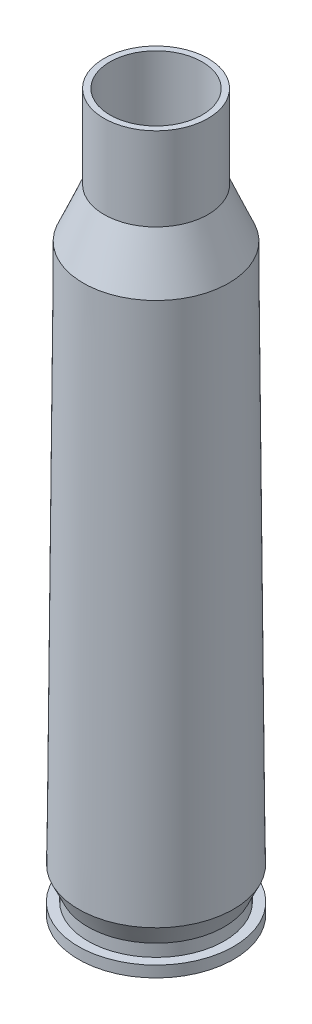
ISO-10303-21;
HEADER;
FILE_DESCRIPTION(('STEP AP214'),'2;1');
FILE_NAME('part.step','',(''),(''),'','','');
FILE_SCHEMA(('AUTOMOTIVE_DESIGN { 1 0 10303 214 1 1 1 1 }'));
ENDSEC;
DATA;
#1=APPLICATION_CONTEXT('core data for automotive mechanical design processes');
#2=APPLICATION_PROTOCOL_DEFINITION('international standard','automotive_design',2000,#1);
#3=PRODUCT_CONTEXT('',#1,'mechanical');
#4=PRODUCT('Part','Part','',(#3));
#5=PRODUCT_RELATED_PRODUCT_CATEGORY('part','',(#4));
#6=PRODUCT_DEFINITION_FORMATION('','',#4);
#7=PRODUCT_DEFINITION_CONTEXT('part definition',#1,'design');
#8=PRODUCT_DEFINITION('design','',#6,#7);
#9=PRODUCT_DEFINITION_SHAPE('','',#8);
#10=(LENGTH_UNIT() NAMED_UNIT(*) SI_UNIT(.MILLI.,.METRE.));
#11=(NAMED_UNIT(*) PLANE_ANGLE_UNIT() SI_UNIT($,.RADIAN.));
#12=(NAMED_UNIT(*) SI_UNIT($,.STERADIAN.) SOLID_ANGLE_UNIT());
#13=UNCERTAINTY_MEASURE_WITH_UNIT(LENGTH_MEASURE(1.E-05),#10,'distance_accuracy_value','');
#14=(GEOMETRIC_REPRESENTATION_CONTEXT(3) GLOBAL_UNCERTAINTY_ASSIGNED_CONTEXT((#13)) GLOBAL_UNIT_ASSIGNED_CONTEXT((#10,
#11,#12)) REPRESENTATION_CONTEXT('',''));
#15=CARTESIAN_POINT('',(0.,0.,0.));
#16=DIRECTION('',(0.,0.,1.));
#17=DIRECTION('',(1.,0.,0.));
#18=AXIS2_PLACEMENT_3D('',#15,#16,#17);
#19=CARTESIAN_POINT('',(-2.85,44.7,0.));
#20=DIRECTION('',(0.,-1.,0.));
#21=DIRECTION('',(0.,0.,-1.));
#22=AXIS2_PLACEMENT_3D('',#19,#20,#21);
#23=PLANE('',#22);
#24=CARTESIAN_POINT('',(0.,44.7,0.));
#25=DIRECTION('',(0.,-1.,0.));
#26=DIRECTION('',(0.,0.,-1.));
#27=AXIS2_PLACEMENT_3D('',#24,#25,#26);
#28=CIRCLE('',#27,3.215);
#29=CARTESIAN_POINT('',(0.,44.7,-3.215));
#30=VERTEX_POINT('',#29);
#31=EDGE_CURVE('E10',#30,#30,#28,.T.);
#32=ORIENTED_EDGE('',*,*,#31,.F.);
#33=EDGE_LOOP('',(#32));
#34=FACE_BOUND('',#33,.T.);
#35=CARTESIAN_POINT('',(0.,44.7,0.));
#36=DIRECTION('',(0.,-1.,0.));
#37=DIRECTION('',(0.,0.,-1.));
#38=AXIS2_PLACEMENT_3D('',#35,#36,#37);
#39=CIRCLE('',#38,2.85);
#40=CARTESIAN_POINT('',(0.,44.7,-2.85));
#41=VERTEX_POINT('',#40);
#42=EDGE_CURVE('E79',#41,#41,#39,.T.);
#43=ORIENTED_EDGE('',*,*,#42,.T.);
#44=EDGE_LOOP('',(#43));
#45=FACE_BOUND('',#44,.T.);
#46=ADVANCED_FACE('F30',(#34,#45),#23,.F.);
#47=CARTESIAN_POINT('',(0.,0.,0.));
#48=DIRECTION('',(0.,-1.,0.));
#49=DIRECTION('',(0.,0.,-1.));
#50=AXIS2_PLACEMENT_3D('',#47,#48,#49);
#51=CYLINDRICAL_SURFACE('',#50,3.215);
#52=CARTESIAN_POINT('',(0.,39.55,0.));
#53=DIRECTION('',(0.,-1.,0.));
#54=DIRECTION('',(0.,0.,-1.));
#55=AXIS2_PLACEMENT_3D('',#52,#53,#54);
#56=CIRCLE('',#55,3.215);
#57=CARTESIAN_POINT('',(0.,39.55,-3.215));
#58=VERTEX_POINT('',#57);
#59=EDGE_CURVE('E36',#58,#58,#56,.T.);
#60=ORIENTED_EDGE('',*,*,#59,.F.);
#61=EDGE_LOOP('',(#60));
#62=FACE_BOUND('',#61,.T.);
#63=ORIENTED_EDGE('',*,*,#31,.T.);
#64=EDGE_LOOP('',(#63));
#65=FACE_BOUND('',#64,.T.);
#66=ADVANCED_FACE('F125',(#62,#65),#51,.T.);
#67=CARTESIAN_POINT('',(0.,39.55,0.));
#68=DIRECTION('',(0.,-1.,0.));
#69=DIRECTION('',(0.,0.,-1.));
#70=AXIS2_PLACEMENT_3D('',#67,#68,#69);
#71=CONICAL_SURFACE('',#70,3.215,0.401101658812282);
#72=CARTESIAN_POINT('',(0.,36.52,0.));
#73=DIRECTION('',(0.,-1.,0.));
#74=DIRECTION('',(0.,0.,-1.));
#75=AXIS2_PLACEMENT_3D('',#72,#73,#74);
#76=CIRCLE('',#75,4.5);
#77=CARTESIAN_POINT('',(0.,36.52,-4.5));
#78=VERTEX_POINT('',#77);
#79=EDGE_CURVE('E40',#78,#78,#76,.T.);
#80=ORIENTED_EDGE('',*,*,#79,.F.);
#81=EDGE_LOOP('',(#80));
#82=FACE_BOUND('',#81,.T.);
#83=ORIENTED_EDGE('',*,*,#59,.T.);
#84=EDGE_LOOP('',(#83));
#85=FACE_BOUND('',#84,.T.);
#86=ADVANCED_FACE('F130',(#82,#85),#71,.T.);
#87=CARTESIAN_POINT('',(0.,36.52,0.));
#88=DIRECTION('',(0.,-1.,0.));
#89=DIRECTION('',(0.,0.,-1.));
#90=AXIS2_PLACEMENT_3D('',#87,#88,#89);
#91=CONICAL_SURFACE('',#90,4.5,0.00868501672487274);
#92=CARTESIAN_POINT('',(0.,3.13,0.));
#93=DIRECTION('',(0.,-1.,0.));
#94=DIRECTION('',(0.,0.,-1.));
#95=AXIS2_PLACEMENT_3D('',#92,#93,#94);
#96=CIRCLE('',#95,4.79);
#97=CARTESIAN_POINT('',(0.,3.13,-4.79));
#98=VERTEX_POINT('',#97);
#99=EDGE_CURVE('E44',#98,#98,#96,.T.);
#100=ORIENTED_EDGE('',*,*,#99,.F.);
#101=EDGE_LOOP('',(#100));
#102=FACE_BOUND('',#101,.T.);
#103=ORIENTED_EDGE('',*,*,#79,.T.);
#104=EDGE_LOOP('',(#103));
#105=FACE_BOUND('',#104,.T.);
#106=ADVANCED_FACE('F135',(#102,#105),#91,.T.);
#107=CARTESIAN_POINT('',(0.,3.13,0.));
#108=DIRECTION('',(0.,1.,0.));
#109=DIRECTION('',(0.,0.,1.));
#110=AXIS2_PLACEMENT_3D('',#107,#108,#109);
#111=CONICAL_SURFACE('',#110,4.79,0.436332312998583);
#112=CARTESIAN_POINT('',(0.,1.9,0.));
#113=DIRECTION('',(0.,-1.,0.));
#114=DIRECTION('',(0.,0.,-1.));
#115=AXIS2_PLACEMENT_3D('',#112,#113,#114);
#116=CIRCLE('',#115,4.21644158046935);
#117=CARTESIAN_POINT('',(0.,1.9,-4.21644158046935));
#118=VERTEX_POINT('',#117);
#119=EDGE_CURVE('E49',#118,#118,#116,.T.);
#120=ORIENTED_EDGE('',*,*,#119,.F.);
#121=EDGE_LOOP('',(#120));
#122=FACE_BOUND('',#121,.T.);
#123=ORIENTED_EDGE('',*,*,#99,.T.);
#124=EDGE_LOOP('',(#123));
#125=FACE_BOUND('',#124,.T.);
#126=ADVANCED_FACE('F141',(#122,#125),#111,.T.);
#127=CARTESIAN_POINT('',(0.,0.,0.));
#128=DIRECTION('',(0.,-1.,0.));
#129=DIRECTION('',(0.,0.,-1.));
#130=AXIS2_PLACEMENT_3D('',#127,#128,#129);
#131=CYLINDRICAL_SURFACE('',#130,4.21644158046935);
#132=CARTESIAN_POINT('',(0.,1.14,0.));
#133=DIRECTION('',(0.,-1.,0.));
#134=DIRECTION('',(0.,0.,-1.));
#135=AXIS2_PLACEMENT_3D('',#132,#133,#134);
#136=CIRCLE('',#135,4.21644158046935);
#137=CARTESIAN_POINT('',(0.,1.14,-4.21644158046935));
#138=VERTEX_POINT('',#137);
#139=EDGE_CURVE('E52',#138,#138,#136,.T.);
#140=ORIENTED_EDGE('',*,*,#139,.F.);
#141=EDGE_LOOP('',(#140));
#142=FACE_BOUND('',#141,.T.);
#143=ORIENTED_EDGE('',*,*,#119,.T.);
#144=EDGE_LOOP('',(#143));
#145=FACE_BOUND('',#144,.T.);
#146=ADVANCED_FACE('F145',(#142,#145),#131,.T.);
#147=CARTESIAN_POINT('',(-4.8,1.14,0.));
#148=DIRECTION('',(0.,-1.,0.));
#149=DIRECTION('',(0.,0.,-1.));
#150=AXIS2_PLACEMENT_3D('',#147,#148,#149);
#151=PLANE('',#150);
#152=CARTESIAN_POINT('',(0.,1.14,0.));
#153=DIRECTION('',(0.,-1.,0.));
#154=DIRECTION('',(0.,0.,-1.));
#155=AXIS2_PLACEMENT_3D('',#152,#153,#154);
#156=CIRCLE('',#155,4.8);
#157=CARTESIAN_POINT('',(0.,1.14,-4.8));
#158=VERTEX_POINT('',#157);
#159=EDGE_CURVE('E55',#158,#158,#156,.T.);
#160=ORIENTED_EDGE('',*,*,#159,.F.);
#161=EDGE_LOOP('',(#160));
#162=FACE_BOUND('',#161,.T.);
#163=ORIENTED_EDGE('',*,*,#139,.T.);
#164=EDGE_LOOP('',(#163));
#165=FACE_BOUND('',#164,.T.);
#166=ADVANCED_FACE('F149',(#162,#165),#151,.F.);
#167=CARTESIAN_POINT('',(0.,0.,0.));
#168=DIRECTION('',(0.,-1.,0.));
#169=DIRECTION('',(0.,0.,-1.));
#170=AXIS2_PLACEMENT_3D('',#167,#168,#169);
#171=CYLINDRICAL_SURFACE('',#170,4.8);
#172=CARTESIAN_POINT('',(0.,0.449999999999999,0.));
#173=DIRECTION('',(0.,-1.,0.));
#174=DIRECTION('',(0.,0.,-1.));
#175=AXIS2_PLACEMENT_3D('',#172,#173,#174);
#176=CIRCLE('',#175,4.8);
#177=CARTESIAN_POINT('',(0.,0.449999999999999,-4.8));
#178=VERTEX_POINT('',#177);
#179=EDGE_CURVE('E58',#178,#178,#176,.T.);
#180=ORIENTED_EDGE('',*,*,#179,.F.);
#181=EDGE_LOOP('',(#180));
#182=FACE_BOUND('',#181,.T.);
#183=ORIENTED_EDGE('',*,*,#159,.T.);
#184=EDGE_LOOP('',(#183));
#185=FACE_BOUND('',#184,.T.);
#186=ADVANCED_FACE('F153',(#182,#185),#171,.T.);
#187=CARTESIAN_POINT('',(0.,0.449999999999999,0.));
#188=DIRECTION('',(0.,1.,0.));
#189=DIRECTION('',(0.,0.,1.));
#190=AXIS2_PLACEMENT_3D('',#187,#188,#189);
#191=CONICAL_SURFACE('',#190,4.8,0.959931088596887);
#192=CARTESIAN_POINT('',(0.,0.,0.));
#193=DIRECTION('',(0.,-1.,0.));
#194=DIRECTION('',(0.,0.,-1.));
#195=AXIS2_PLACEMENT_3D('',#192,#193,#194);
#196=CIRCLE('',#195,4.15733339696604);
#197=CARTESIAN_POINT('',(0.,0.,-4.15733339696604));
#198=VERTEX_POINT('',#197);
#199=EDGE_CURVE('E61',#198,#198,#196,.T.);
#200=ORIENTED_EDGE('',*,*,#199,.F.);
#201=EDGE_LOOP('',(#200));
#202=FACE_BOUND('',#201,.T.);
#203=ORIENTED_EDGE('',*,*,#179,.T.);
#204=EDGE_LOOP('',(#203));
#205=FACE_BOUND('',#204,.T.);
#206=ADVANCED_FACE('F121',(#202,#205),#191,.T.);
#207=CARTESIAN_POINT('',(0.,0.,0.));
#208=DIRECTION('',(0.,1.,0.));
#209=DIRECTION('',(0.,0.,1.));
#210=AXIS2_PLACEMENT_3D('',#207,#208,#209);
#211=PLANE('',#210);
#212=ORIENTED_EDGE('',*,*,#199,.T.);
#213=EDGE_LOOP('',(#212));
#214=FACE_BOUND('',#213,.T.);
#215=ADVANCED_FACE('F116',(#214),#211,.F.);
#216=CARTESIAN_POINT('',(-3.36846844058709,1.14,0.));
#217=DIRECTION('',(0.,-1.,0.));
#218=DIRECTION('',(0.,0.,-1.));
#219=AXIS2_PLACEMENT_3D('',#216,#217,#218);
#220=PLANE('',#219);
#221=CARTESIAN_POINT('',(0.,1.14,0.));
#222=DIRECTION('',(0.,-1.,0.));
#223=DIRECTION('',(0.,0.,-1.));
#224=AXIS2_PLACEMENT_3D('',#221,#222,#223);
#225=CIRCLE('',#224,3.36846844058709);
#226=CARTESIAN_POINT('',(0.,1.14,-3.36846844058709));
#227=VERTEX_POINT('',#226);
#228=EDGE_CURVE('E64',#227,#227,#225,.T.);
#229=ORIENTED_EDGE('',*,*,#228,.F.);
#230=EDGE_LOOP('',(#229));
#231=FACE_BOUND('',#230,.T.);
#232=ADVANCED_FACE('F111',(#231),#220,.F.);
#233=CARTESIAN_POINT('',(0.,0.,0.));
#234=DIRECTION('',(0.,-1.,0.));
#235=DIRECTION('',(0.,0.,-1.));
#236=AXIS2_PLACEMENT_3D('',#233,#234,#235);
#237=CYLINDRICAL_SURFACE('',#236,3.36846844058709);
#238=CARTESIAN_POINT('',(0.,1.9,0.));
#239=DIRECTION('',(0.,-1.,0.));
#240=DIRECTION('',(0.,0.,-1.));
#241=AXIS2_PLACEMENT_3D('',#238,#239,#240);
#242=CIRCLE('',#241,3.36846844058709);
#243=CARTESIAN_POINT('',(0.,1.9,-3.36846844058709));
#244=VERTEX_POINT('',#243);
#245=EDGE_CURVE('E67',#244,#244,#242,.T.);
#246=ORIENTED_EDGE('',*,*,#245,.F.);
#247=EDGE_LOOP('',(#246));
#248=FACE_BOUND('',#247,.T.);
#249=ORIENTED_EDGE('',*,*,#228,.T.);
#250=EDGE_LOOP('',(#249));
#251=FACE_BOUND('',#250,.T.);
#252=ADVANCED_FACE('F105',(#248,#251),#237,.F.);
#253=CARTESIAN_POINT('',(0.,1.9,0.));
#254=DIRECTION('',(0.,1.,0.));
#255=DIRECTION('',(0.,0.,1.));
#256=AXIS2_PLACEMENT_3D('',#253,#254,#255);
#257=CONICAL_SURFACE('',#256,3.36846844058709,0.436332312998584);
#258=CARTESIAN_POINT('',(0.,3.13,0.));
#259=DIRECTION('',(0.,-1.,0.));
#260=DIRECTION('',(0.,0.,-1.));
#261=AXIS2_PLACEMENT_3D('',#258,#259,#260);
#262=CIRCLE('',#261,3.94202686011774);
#263=CARTESIAN_POINT('',(0.,3.13,-3.94202686011774));
#264=VERTEX_POINT('',#263);
#265=EDGE_CURVE('E70',#264,#264,#262,.T.);
#266=ORIENTED_EDGE('',*,*,#265,.F.);
#267=EDGE_LOOP('',(#266));
#268=FACE_BOUND('',#267,.T.);
#269=ORIENTED_EDGE('',*,*,#245,.T.);
#270=EDGE_LOOP('',(#269));
#271=FACE_BOUND('',#270,.T.);
#272=ADVANCED_FACE('F99',(#268,#271),#257,.F.);
#273=CARTESIAN_POINT('',(0.,0.,0.));
#274=DIRECTION('',(0.,-1.,0.));
#275=DIRECTION('',(0.,0.,-1.));
#276=AXIS2_PLACEMENT_3D('',#273,#274,#275);
#277=CYLINDRICAL_SURFACE('',#276,3.94202686011774);
#278=CARTESIAN_POINT('',(0.,36.3214334578176,0.));
#279=DIRECTION('',(0.,-1.,0.));
#280=DIRECTION('',(0.,0.,-1.));
#281=AXIS2_PLACEMENT_3D('',#278,#279,#280);
#282=CIRCLE('',#281,3.94202686011774);
#283=CARTESIAN_POINT('',(0.,36.3214334578176,-3.94202686011774));
#284=VERTEX_POINT('',#283);
#285=EDGE_CURVE('E73',#284,#284,#282,.T.);
#286=ORIENTED_EDGE('',*,*,#285,.F.);
#287=EDGE_LOOP('',(#286));
#288=FACE_BOUND('',#287,.T.);
#289=ORIENTED_EDGE('',*,*,#265,.T.);
#290=EDGE_LOOP('',(#289));
#291=FACE_BOUND('',#290,.T.);
#292=ADVANCED_FACE('F93',(#288,#291),#277,.F.);
#293=CARTESIAN_POINT('',(0.,36.3214334578176,0.));
#294=DIRECTION('',(0.,-1.,0.));
#295=DIRECTION('',(0.,0.,-1.));
#296=AXIS2_PLACEMENT_3D('',#293,#294,#295);
#297=CONICAL_SURFACE('',#296,3.94202686011774,0.336702494975874);
#298=CARTESIAN_POINT('',(0.,39.4412332862436,0.));
#299=DIRECTION('',(0.,-1.,0.));
#300=DIRECTION('',(0.,0.,-1.));
#301=AXIS2_PLACEMENT_3D('',#298,#299,#300);
#302=CIRCLE('',#301,2.85);
#303=CARTESIAN_POINT('',(0.,39.4412332862436,-2.85));
#304=VERTEX_POINT('',#303);
#305=EDGE_CURVE('E76',#304,#304,#302,.T.);
#306=ORIENTED_EDGE('',*,*,#305,.F.);
#307=EDGE_LOOP('',(#306));
#308=FACE_BOUND('',#307,.T.);
#309=ORIENTED_EDGE('',*,*,#285,.T.);
#310=EDGE_LOOP('',(#309));
#311=FACE_BOUND('',#310,.T.);
#312=ADVANCED_FACE('F87',(#308,#311),#297,.F.);
#313=CARTESIAN_POINT('',(0.,0.,0.));
#314=DIRECTION('',(0.,-1.,0.));
#315=DIRECTION('',(0.,0.,-1.));
#316=AXIS2_PLACEMENT_3D('',#313,#314,#315);
#317=CYLINDRICAL_SURFACE('',#316,2.85);
#318=ORIENTED_EDGE('',*,*,#42,.F.);
#319=EDGE_LOOP('',(#318));
#320=FACE_BOUND('',#319,.T.);
#321=ORIENTED_EDGE('',*,*,#305,.T.);
#322=EDGE_LOOP('',(#321));
#323=FACE_BOUND('',#322,.T.);
#324=ADVANCED_FACE('F84',(#320,#323),#317,.F.);
#325=CLOSED_SHELL('',(#46,#66,#86,#106,#126,#146,#166,#186,#206,#215,#232,#252,#272,#292,#312,#324));
#326=MANIFOLD_SOLID_BREP('B2',#325);
#327=ADVANCED_BREP_SHAPE_REPRESENTATION('',(#18,#326),#14);
#328=SHAPE_DEFINITION_REPRESENTATION(#9,#327);
ENDSEC;
END-ISO-10303-21;
